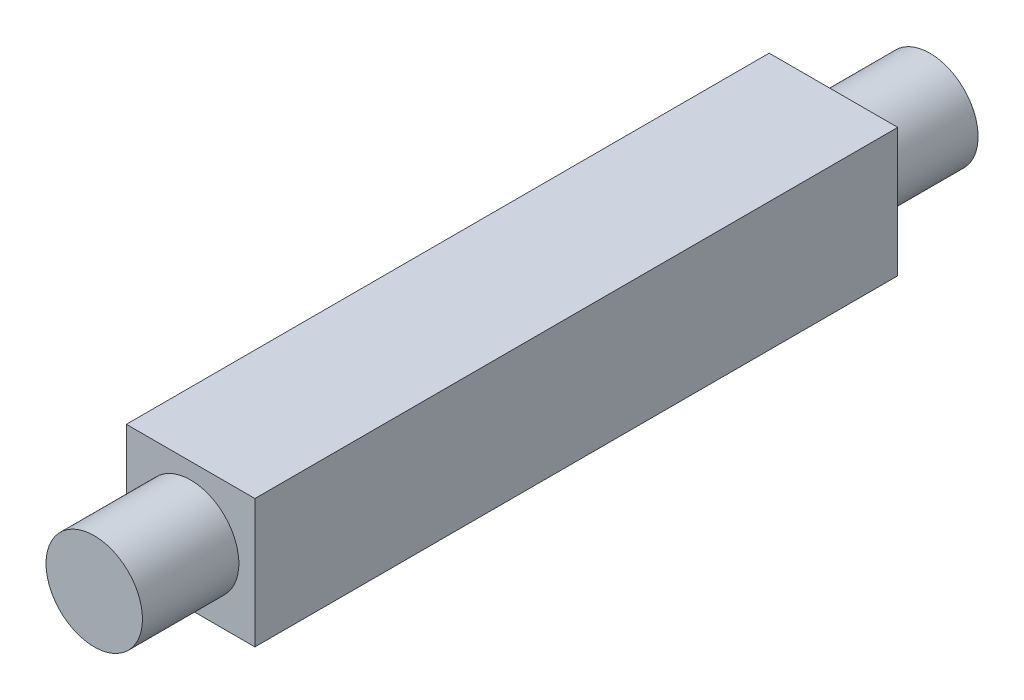
ISO-10303-21;
HEADER;
FILE_DESCRIPTION(('STEP AP214'),'2;1');
FILE_NAME('part.step','',(''),(''),'','','');
FILE_SCHEMA(('AUTOMOTIVE_DESIGN { 1 0 10303 214 1 1 1 1 }'));
ENDSEC;
DATA;
#1=APPLICATION_CONTEXT('core data for automotive mechanical design processes');
#2=APPLICATION_PROTOCOL_DEFINITION('international standard','automotive_design',2000,#1);
#3=PRODUCT_CONTEXT('',#1,'mechanical');
#4=PRODUCT('Part','Part','',(#3));
#5=PRODUCT_RELATED_PRODUCT_CATEGORY('part','',(#4));
#6=PRODUCT_DEFINITION_FORMATION('','',#4);
#7=PRODUCT_DEFINITION_CONTEXT('part definition',#1,'design');
#8=PRODUCT_DEFINITION('design','',#6,#7);
#9=PRODUCT_DEFINITION_SHAPE('','',#8);
#10=(LENGTH_UNIT() NAMED_UNIT(*) SI_UNIT(.MILLI.,.METRE.));
#11=(NAMED_UNIT(*) PLANE_ANGLE_UNIT() SI_UNIT($,.RADIAN.));
#12=(NAMED_UNIT(*) SI_UNIT($,.STERADIAN.) SOLID_ANGLE_UNIT());
#13=UNCERTAINTY_MEASURE_WITH_UNIT(LENGTH_MEASURE(1.E-05),#10,'distance_accuracy_value','');
#14=(GEOMETRIC_REPRESENTATION_CONTEXT(3) GLOBAL_UNCERTAINTY_ASSIGNED_CONTEXT((#13)) GLOBAL_UNIT_ASSIGNED_CONTEXT((#10,
#11,#12)) REPRESENTATION_CONTEXT('',''));
#15=CARTESIAN_POINT('',(0.,0.,0.));
#16=DIRECTION('',(0.,0.,1.));
#17=DIRECTION('',(1.,0.,0.));
#18=AXIS2_PLACEMENT_3D('',#15,#16,#17);
#19=CARTESIAN_POINT('',(2.,-2.,20.));
#20=DIRECTION('',(-1.,0.,0.));
#21=DIRECTION('',(0.,0.,1.));
#22=AXIS2_PLACEMENT_3D('',#19,#20,#21);
#23=PLANE('',#22);
#24=DIRECTION('',(0.,1.,0.));
#25=VECTOR('',#24,1.);
#26=CARTESIAN_POINT('',(2.,-2.,0.));
#27=LINE('',#26,#25);
#28=CARTESIAN_POINT('',(2.,-2.,0.));
#29=VERTEX_POINT('',#28);
#30=CARTESIAN_POINT('',(2.,2.,0.));
#31=VERTEX_POINT('',#30);
#32=EDGE_CURVE('E95',#29,#31,#27,.T.);
#33=ORIENTED_EDGE('',*,*,#32,.T.);
#34=DIRECTION('',(0.,0.,-1.));
#35=VECTOR('',#34,1.);
#36=CARTESIAN_POINT('',(2.,2.,20.));
#37=LINE('',#36,#35);
#38=CARTESIAN_POINT('',(2.,2.,20.));
#39=VERTEX_POINT('',#38);
#40=EDGE_CURVE('E11',#39,#31,#37,.T.);
#41=ORIENTED_EDGE('',*,*,#40,.F.);
#42=DIRECTION('',(0.,1.,0.));
#43=VECTOR('',#42,1.);
#44=CARTESIAN_POINT('',(2.,-2.,20.));
#45=LINE('',#44,#43);
#46=CARTESIAN_POINT('',(2.,-2.,20.));
#47=VERTEX_POINT('',#46);
#48=EDGE_CURVE('E83',#47,#39,#45,.T.);
#49=ORIENTED_EDGE('',*,*,#48,.F.);
#50=DIRECTION('',(0.,0.,-1.));
#51=VECTOR('',#50,1.);
#52=CARTESIAN_POINT('',(2.,-2.,20.));
#53=LINE('',#52,#51);
#54=EDGE_CURVE('E91',#47,#29,#53,.T.);
#55=ORIENTED_EDGE('',*,*,#54,.T.);
#56=EDGE_LOOP('',(#33,#41,#49,#55));
#57=FACE_BOUND('',#56,.T.);
#58=ADVANCED_FACE('F32',(#57),#23,.F.);
#59=CARTESIAN_POINT('',(-2.,2.,20.));
#60=DIRECTION('',(0.,-1.,0.));
#61=DIRECTION('',(0.,0.,-1.));
#62=AXIS2_PLACEMENT_3D('',#59,#60,#61);
#63=PLANE('',#62);
#64=DIRECTION('',(-1.,0.,0.));
#65=VECTOR('',#64,1.);
#66=CARTESIAN_POINT('',(-2.,2.,0.));
#67=LINE('',#66,#65);
#68=CARTESIAN_POINT('',(-2.,2.,0.));
#69=VERTEX_POINT('',#68);
#70=EDGE_CURVE('E87',#31,#69,#67,.T.);
#71=ORIENTED_EDGE('',*,*,#70,.T.);
#72=DIRECTION('',(0.,0.,-1.));
#73=VECTOR('',#72,1.);
#74=CARTESIAN_POINT('',(-2.,2.,20.));
#75=LINE('',#74,#73);
#76=CARTESIAN_POINT('',(-2.,2.,20.));
#77=VERTEX_POINT('',#76);
#78=EDGE_CURVE('E40',#77,#69,#75,.T.);
#79=ORIENTED_EDGE('',*,*,#78,.F.);
#80=DIRECTION('',(-1.,0.,0.));
#81=VECTOR('',#80,1.);
#82=CARTESIAN_POINT('',(-2.,2.,20.));
#83=LINE('',#82,#81);
#84=EDGE_CURVE('E78',#39,#77,#83,.T.);
#85=ORIENTED_EDGE('',*,*,#84,.F.);
#86=ORIENTED_EDGE('',*,*,#40,.T.);
#87=EDGE_LOOP('',(#71,#79,#85,#86));
#88=FACE_BOUND('',#87,.T.);
#89=ADVANCED_FACE('F86',(#88),#63,.F.);
#90=CARTESIAN_POINT('',(-2.,-2.,20.));
#91=DIRECTION('',(1.,0.,0.));
#92=DIRECTION('',(0.,0.,-1.));
#93=AXIS2_PLACEMENT_3D('',#90,#91,#92);
#94=PLANE('',#93);
#95=DIRECTION('',(0.,-1.,0.));
#96=VECTOR('',#95,1.);
#97=CARTESIAN_POINT('',(-2.,-2.,0.));
#98=LINE('',#97,#96);
#99=CARTESIAN_POINT('',(-2.,-2.,0.));
#100=VERTEX_POINT('',#99);
#101=EDGE_CURVE('E65',#69,#100,#98,.T.);
#102=ORIENTED_EDGE('',*,*,#101,.T.);
#103=DIRECTION('',(0.,0.,-1.));
#104=VECTOR('',#103,1.);
#105=CARTESIAN_POINT('',(-2.,-2.,20.));
#106=LINE('',#105,#104);
#107=CARTESIAN_POINT('',(-2.,-2.,20.));
#108=VERTEX_POINT('',#107);
#109=EDGE_CURVE('E88',#108,#100,#106,.T.);
#110=ORIENTED_EDGE('',*,*,#109,.F.);
#111=DIRECTION('',(0.,-1.,0.));
#112=VECTOR('',#111,1.);
#113=CARTESIAN_POINT('',(-2.,-2.,20.));
#114=LINE('',#113,#112);
#115=EDGE_CURVE('E81',#77,#108,#114,.T.);
#116=ORIENTED_EDGE('',*,*,#115,.F.);
#117=ORIENTED_EDGE('',*,*,#78,.T.);
#118=EDGE_LOOP('',(#102,#110,#116,#117));
#119=FACE_BOUND('',#118,.T.);
#120=ADVANCED_FACE('F89',(#119),#94,.F.);
#121=CARTESIAN_POINT('',(-2.,-2.,20.));
#122=DIRECTION('',(0.,1.,0.));
#123=DIRECTION('',(0.,0.,1.));
#124=AXIS2_PLACEMENT_3D('',#121,#122,#123);
#125=PLANE('',#124);
#126=DIRECTION('',(1.,0.,0.));
#127=VECTOR('',#126,1.);
#128=CARTESIAN_POINT('',(-2.,-2.,0.));
#129=LINE('',#128,#127);
#130=EDGE_CURVE('E71',#100,#29,#129,.T.);
#131=ORIENTED_EDGE('',*,*,#130,.T.);
#132=ORIENTED_EDGE('',*,*,#54,.F.);
#133=DIRECTION('',(1.,0.,0.));
#134=VECTOR('',#133,1.);
#135=CARTESIAN_POINT('',(-2.,-2.,20.));
#136=LINE('',#135,#134);
#137=EDGE_CURVE('E48',#108,#47,#136,.T.);
#138=ORIENTED_EDGE('',*,*,#137,.F.);
#139=ORIENTED_EDGE('',*,*,#109,.T.);
#140=EDGE_LOOP('',(#131,#132,#138,#139));
#141=FACE_BOUND('',#140,.T.);
#142=ADVANCED_FACE('F103',(#141),#125,.F.);
#143=CARTESIAN_POINT('',(0.,0.,20.));
#144=DIRECTION('',(0.,0.,-1.));
#145=DIRECTION('',(-1.,0.,0.));
#146=AXIS2_PLACEMENT_3D('',#143,#144,#145);
#147=PLANE('',#146);
#148=CARTESIAN_POINT('',(0.,0.,20.));
#149=DIRECTION('',(0.,0.,-1.));
#150=DIRECTION('',(-1.,0.,0.));
#151=AXIS2_PLACEMENT_3D('',#148,#149,#150);
#152=CIRCLE('',#151,1.5);
#153=CARTESIAN_POINT('',(-1.5,0.,20.));
#154=VERTEX_POINT('',#153);
#155=EDGE_CURVE('E115',#154,#154,#152,.T.);
#156=ORIENTED_EDGE('',*,*,#155,.T.);
#157=EDGE_LOOP('',(#156));
#158=FACE_BOUND('',#157,.T.);
#159=ORIENTED_EDGE('',*,*,#48,.T.);
#160=ORIENTED_EDGE('',*,*,#84,.T.);
#161=ORIENTED_EDGE('',*,*,#115,.T.);
#162=ORIENTED_EDGE('',*,*,#137,.T.);
#163=EDGE_LOOP('',(#159,#160,#161,#162));
#164=FACE_BOUND('',#163,.T.);
#165=ADVANCED_FACE('F79',(#158,#164),#147,.F.);
#166=CARTESIAN_POINT('',(0.,0.,0.));
#167=DIRECTION('',(0.,0.,-1.));
#168=DIRECTION('',(-1.,0.,0.));
#169=AXIS2_PLACEMENT_3D('',#166,#167,#168);
#170=PLANE('',#169);
#171=CARTESIAN_POINT('',(0.,0.,0.));
#172=DIRECTION('',(0.,0.,-1.));
#173=DIRECTION('',(-1.,0.,0.));
#174=AXIS2_PLACEMENT_3D('',#171,#172,#173);
#175=CIRCLE('',#174,1.5);
#176=CARTESIAN_POINT('',(-1.5,0.,0.));
#177=VERTEX_POINT('',#176);
#178=EDGE_CURVE('E109',#177,#177,#175,.T.);
#179=ORIENTED_EDGE('',*,*,#178,.F.);
#180=EDGE_LOOP('',(#179));
#181=FACE_BOUND('',#180,.T.);
#182=ORIENTED_EDGE('',*,*,#32,.F.);
#183=ORIENTED_EDGE('',*,*,#130,.F.);
#184=ORIENTED_EDGE('',*,*,#101,.F.);
#185=ORIENTED_EDGE('',*,*,#70,.F.);
#186=EDGE_LOOP('',(#182,#183,#184,#185));
#187=FACE_BOUND('',#186,.T.);
#188=ADVANCED_FACE('F106',(#181,#187),#170,.T.);
#189=CARTESIAN_POINT('',(0.,0.,-3.));
#190=DIRECTION('',(0.,0.,1.));
#191=DIRECTION('',(1.,0.,0.));
#192=AXIS2_PLACEMENT_3D('',#189,#190,#191);
#193=CYLINDRICAL_SURFACE('',#192,1.5);
#194=CARTESIAN_POINT('',(0.,0.,-3.));
#195=DIRECTION('',(0.,0.,-1.));
#196=DIRECTION('',(-1.,0.,0.));
#197=AXIS2_PLACEMENT_3D('',#194,#195,#196);
#198=CIRCLE('',#197,1.5);
#199=CARTESIAN_POINT('',(-1.5,0.,-3.));
#200=VERTEX_POINT('',#199);
#201=EDGE_CURVE('E98',#200,#200,#198,.T.);
#202=ORIENTED_EDGE('',*,*,#201,.F.);
#203=EDGE_LOOP('',(#202));
#204=FACE_BOUND('',#203,.T.);
#205=ORIENTED_EDGE('',*,*,#178,.T.);
#206=EDGE_LOOP('',(#205));
#207=FACE_BOUND('',#206,.T.);
#208=ADVANCED_FACE('F145',(#204,#207),#193,.T.);
#209=CARTESIAN_POINT('',(0.,0.,-3.));
#210=DIRECTION('',(0.,0.,-1.));
#211=DIRECTION('',(-1.,0.,0.));
#212=AXIS2_PLACEMENT_3D('',#209,#210,#211);
#213=PLANE('',#212);
#214=ORIENTED_EDGE('',*,*,#201,.T.);
#215=EDGE_LOOP('',(#214));
#216=FACE_BOUND('',#215,.T.);
#217=ADVANCED_FACE('F130',(#216),#213,.T.);
#218=CARTESIAN_POINT('',(0.,0.,23.));
#219=DIRECTION('',(0.,0.,-1.));
#220=DIRECTION('',(-1.,0.,0.));
#221=AXIS2_PLACEMENT_3D('',#218,#219,#220);
#222=CYLINDRICAL_SURFACE('',#221,1.5);
#223=CARTESIAN_POINT('',(0.,0.,23.));
#224=DIRECTION('',(0.,0.,-1.));
#225=DIRECTION('',(-1.,0.,0.));
#226=AXIS2_PLACEMENT_3D('',#223,#224,#225);
#227=CIRCLE('',#226,1.5);
#228=CARTESIAN_POINT('',(-1.5,0.,23.));
#229=VERTEX_POINT('',#228);
#230=EDGE_CURVE('E112',#229,#229,#227,.T.);
#231=ORIENTED_EDGE('',*,*,#230,.T.);
#232=EDGE_LOOP('',(#231));
#233=FACE_BOUND('',#232,.T.);
#234=ORIENTED_EDGE('',*,*,#155,.F.);
#235=EDGE_LOOP('',(#234));
#236=FACE_BOUND('',#235,.T.);
#237=ADVANCED_FACE('F121',(#233,#236),#222,.T.);
#238=CARTESIAN_POINT('',(0.,0.,23.));
#239=DIRECTION('',(0.,0.,1.));
#240=DIRECTION('',(-1.,0.,0.));
#241=AXIS2_PLACEMENT_3D('',#238,#239,#240);
#242=PLANE('',#241);
#243=ORIENTED_EDGE('',*,*,#230,.F.);
#244=EDGE_LOOP('',(#243));
#245=FACE_BOUND('',#244,.T.);
#246=ADVANCED_FACE('F124',(#245),#242,.T.);
#247=CLOSED_SHELL('',(#58,#89,#120,#142,#165,#188,#208,#217,#237,#246));
#248=MANIFOLD_SOLID_BREP('B2',#247);
#249=ADVANCED_BREP_SHAPE_REPRESENTATION('',(#18,#248),#14);
#250=SHAPE_DEFINITION_REPRESENTATION(#9,#249);
ENDSEC;
END-ISO-10303-21;
